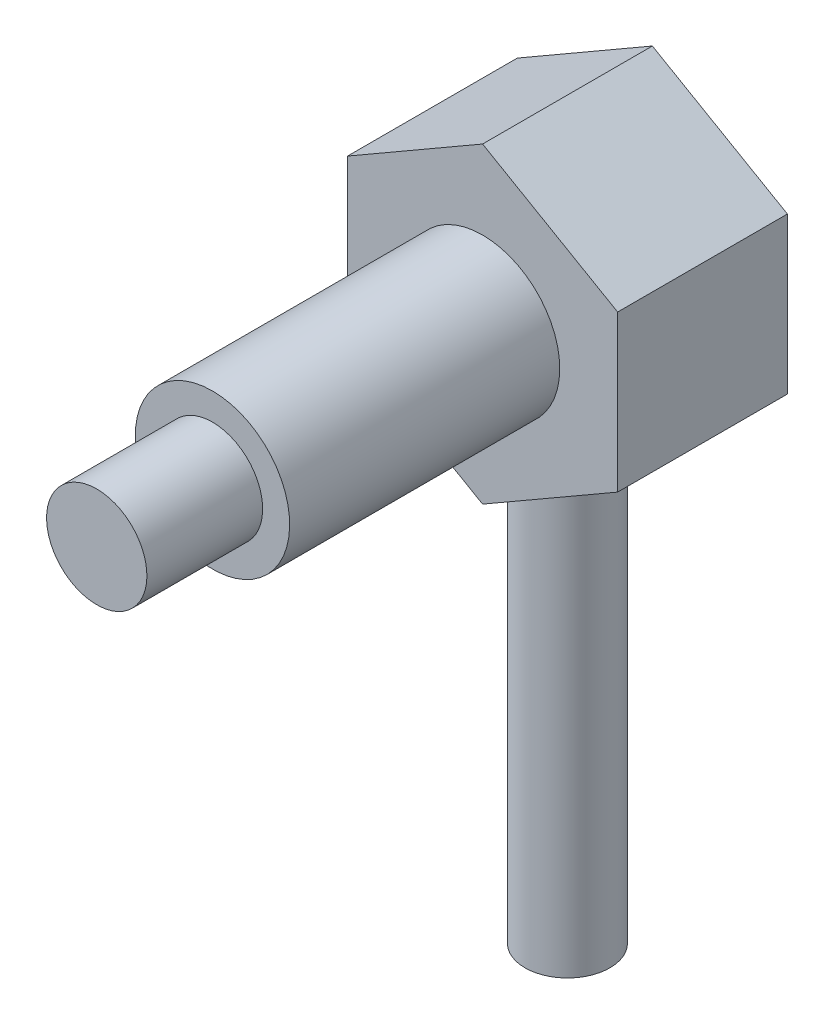
ISO-10303-21;
HEADER;
FILE_DESCRIPTION(('STEP AP214'),'2;1');
FILE_NAME('part.step','',(''),(''),'','','');
FILE_SCHEMA(('AUTOMOTIVE_DESIGN { 1 0 10303 214 1 1 1 1 }'));
ENDSEC;
DATA;
#1=APPLICATION_CONTEXT('core data for automotive mechanical design processes');
#2=APPLICATION_PROTOCOL_DEFINITION('international standard','automotive_design',2000,#1);
#3=PRODUCT_CONTEXT('',#1,'mechanical');
#4=PRODUCT('Part','Part','',(#3));
#5=PRODUCT_RELATED_PRODUCT_CATEGORY('part','',(#4));
#6=PRODUCT_DEFINITION_FORMATION('','',#4);
#7=PRODUCT_DEFINITION_CONTEXT('part definition',#1,'design');
#8=PRODUCT_DEFINITION('design','',#6,#7);
#9=PRODUCT_DEFINITION_SHAPE('','',#8);
#10=(LENGTH_UNIT() NAMED_UNIT(*) SI_UNIT(.MILLI.,.METRE.));
#11=(NAMED_UNIT(*) PLANE_ANGLE_UNIT() SI_UNIT($,.RADIAN.));
#12=(NAMED_UNIT(*) SI_UNIT($,.STERADIAN.) SOLID_ANGLE_UNIT());
#13=UNCERTAINTY_MEASURE_WITH_UNIT(LENGTH_MEASURE(1.E-05),#10,'distance_accuracy_value','');
#14=(GEOMETRIC_REPRESENTATION_CONTEXT(3) GLOBAL_UNCERTAINTY_ASSIGNED_CONTEXT((#13)) GLOBAL_UNIT_ASSIGNED_CONTEXT((#10,
#11,#12)) REPRESENTATION_CONTEXT('',''));
#15=CARTESIAN_POINT('',(0.,0.,0.));
#16=DIRECTION('',(0.,0.,1.));
#17=DIRECTION('',(1.,0.,0.));
#18=AXIS2_PLACEMENT_3D('',#15,#16,#17);
#19=CARTESIAN_POINT('',(0.,-4.04145188432739,4.4));
#20=DIRECTION('',(-0.5,0.866025403784439,0.));
#21=DIRECTION('',(-0.866025403784439,-0.5,0.));
#22=AXIS2_PLACEMENT_3D('',#19,#20,#21);
#23=PLANE('',#22);
#24=DIRECTION('',(0.,0.,-1.));
#25=VECTOR('',#24,1.);
#26=CARTESIAN_POINT('',(0.,-4.04145188432739,4.4));
#27=LINE('',#26,#25);
#28=CARTESIAN_POINT('',(0.,-4.04145188432739,4.4));
#29=VERTEX_POINT('',#28);
#30=CARTESIAN_POINT('',(0.,-4.04145188432739,3.3));
#31=VERTEX_POINT('',#30);
#32=EDGE_CURVE('E98',#29,#31,#27,.T.);
#33=ORIENTED_EDGE('',*,*,#32,.T.);
#34=CARTESIAN_POINT('',(0.,-4.04145188432739,2.2));
#35=DIRECTION('',(-0.5,0.866025403784439,0.));
#36=DIRECTION('',(0.866025403784439,0.5,0.));
#37=AXIS2_PLACEMENT_3D('',#34,#35,#36);
#38=ELLIPSE('',#37,1.27017059221718,1.1);
#39=CARTESIAN_POINT('',(0.,-4.04145188432739,1.1));
#40=VERTEX_POINT('',#39);
#41=EDGE_CURVE('E47',#31,#40,#38,.T.);
#42=ORIENTED_EDGE('',*,*,#41,.T.);
#43=CARTESIAN_POINT('',(0.,-4.04145188432739,0.));
#44=VERTEX_POINT('',#43);
#45=EDGE_CURVE('E95',#40,#44,#27,.T.);
#46=ORIENTED_EDGE('',*,*,#45,.T.);
#47=DIRECTION('',(0.866025403784439,0.5,0.));
#48=VECTOR('',#47,1.);
#49=CARTESIAN_POINT('',(0.,-4.04145188432739,0.));
#50=LINE('',#49,#48);
#51=CARTESIAN_POINT('',(3.5,-2.0207259421637,0.));
#52=VERTEX_POINT('',#51);
#53=EDGE_CURVE('E139',#44,#52,#50,.T.);
#54=ORIENTED_EDGE('',*,*,#53,.T.);
#55=DIRECTION('',(0.,0.,-1.));
#56=VECTOR('',#55,1.);
#57=CARTESIAN_POINT('',(3.5,-2.0207259421637,4.4));
#58=LINE('',#57,#56);
#59=CARTESIAN_POINT('',(3.5,-2.0207259421637,4.4));
#60=VERTEX_POINT('',#59);
#61=EDGE_CURVE('E123',#60,#52,#58,.T.);
#62=ORIENTED_EDGE('',*,*,#61,.F.);
#63=DIRECTION('',(0.866025403784439,0.5,0.));
#64=VECTOR('',#63,1.);
#65=CARTESIAN_POINT('',(0.,-4.04145188432739,4.4));
#66=LINE('',#65,#64);
#67=EDGE_CURVE('E134',#29,#60,#66,.T.);
#68=ORIENTED_EDGE('',*,*,#67,.F.);
#69=EDGE_LOOP('',(#33,#42,#46,#54,#62,#68));
#70=FACE_BOUND('',#69,.T.);
#71=ADVANCED_FACE('F34',(#70),#23,.F.);
#72=CARTESIAN_POINT('',(3.5,-2.0207259421637,4.4));
#73=DIRECTION('',(-1.,0.,0.));
#74=DIRECTION('',(0.,-1.,0.));
#75=AXIS2_PLACEMENT_3D('',#72,#73,#74);
#76=PLANE('',#75);
#77=DIRECTION('',(0.,1.,0.));
#78=VECTOR('',#77,1.);
#79=CARTESIAN_POINT('',(3.5,-2.0207259421637,0.));
#80=LINE('',#79,#78);
#81=CARTESIAN_POINT('',(3.49999999999999,2.02072594216368,0.));
#82=VERTEX_POINT('',#81);
#83=EDGE_CURVE('E142',#52,#82,#80,.T.);
#84=ORIENTED_EDGE('',*,*,#83,.T.);
#85=DIRECTION('',(0.,0.,-1.));
#86=VECTOR('',#85,1.);
#87=CARTESIAN_POINT('',(3.49999999999999,2.02072594216368,4.4));
#88=LINE('',#87,#86);
#89=CARTESIAN_POINT('',(3.49999999999999,2.02072594216368,4.4));
#90=VERTEX_POINT('',#89);
#91=EDGE_CURVE('E120',#90,#82,#88,.T.);
#92=ORIENTED_EDGE('',*,*,#91,.F.);
#93=DIRECTION('',(0.,1.,0.));
#94=VECTOR('',#93,1.);
#95=CARTESIAN_POINT('',(3.5,-2.0207259421637,4.4));
#96=LINE('',#95,#94);
#97=EDGE_CURVE('E136',#60,#90,#96,.T.);
#98=ORIENTED_EDGE('',*,*,#97,.F.);
#99=ORIENTED_EDGE('',*,*,#61,.T.);
#100=EDGE_LOOP('',(#84,#92,#98,#99));
#101=FACE_BOUND('',#100,.T.);
#102=ADVANCED_FACE('F141',(#101),#76,.F.);
#103=CARTESIAN_POINT('',(3.49999999999999,2.02072594216368,4.4));
#104=DIRECTION('',(-0.5,-0.866025403784439,0.));
#105=DIRECTION('',(0.866025403784439,-0.5,0.));
#106=AXIS2_PLACEMENT_3D('',#103,#104,#105);
#107=PLANE('',#106);
#108=DIRECTION('',(-0.866025403784438,0.5,0.));
#109=VECTOR('',#108,1.);
#110=CARTESIAN_POINT('',(3.49999999999999,2.02072594216368,0.));
#111=LINE('',#110,#109);
#112=CARTESIAN_POINT('',(0.,4.04145188432737,0.));
#113=VERTEX_POINT('',#112);
#114=EDGE_CURVE('E164',#82,#113,#111,.T.);
#115=ORIENTED_EDGE('',*,*,#114,.T.);
#116=DIRECTION('',(0.,0.,-1.));
#117=VECTOR('',#116,1.);
#118=CARTESIAN_POINT('',(0.,4.04145188432737,4.4));
#119=LINE('',#118,#117);
#120=CARTESIAN_POINT('',(0.,4.04145188432737,4.4));
#121=VERTEX_POINT('',#120);
#122=EDGE_CURVE('E117',#121,#113,#119,.T.);
#123=ORIENTED_EDGE('',*,*,#122,.F.);
#124=DIRECTION('',(-0.866025403784438,0.5,0.));
#125=VECTOR('',#124,1.);
#126=CARTESIAN_POINT('',(3.49999999999999,2.02072594216368,4.4));
#127=LINE('',#126,#125);
#128=EDGE_CURVE('E144',#90,#121,#127,.T.);
#129=ORIENTED_EDGE('',*,*,#128,.F.);
#130=ORIENTED_EDGE('',*,*,#91,.T.);
#131=EDGE_LOOP('',(#115,#123,#129,#130));
#132=FACE_BOUND('',#131,.T.);
#133=ADVANCED_FACE('F191',(#132),#107,.F.);
#134=CARTESIAN_POINT('',(0.,4.04145188432737,4.4));
#135=DIRECTION('',(0.5,-0.866025403784439,0.));
#136=DIRECTION('',(0.866025403784439,0.5,0.));
#137=AXIS2_PLACEMENT_3D('',#134,#135,#136);
#138=PLANE('',#137);
#139=DIRECTION('',(-0.866025403784439,-0.5,0.));
#140=VECTOR('',#139,1.);
#141=CARTESIAN_POINT('',(0.,4.04145188432737,0.));
#142=LINE('',#141,#140);
#143=CARTESIAN_POINT('',(-3.5,2.02072594216368,0.));
#144=VERTEX_POINT('',#143);
#145=EDGE_CURVE('E160',#113,#144,#142,.T.);
#146=ORIENTED_EDGE('',*,*,#145,.T.);
#147=DIRECTION('',(0.,0.,-1.));
#148=VECTOR('',#147,1.);
#149=CARTESIAN_POINT('',(-3.5,2.02072594216368,4.4));
#150=LINE('',#149,#148);
#151=CARTESIAN_POINT('',(-3.5,2.02072594216368,4.4));
#152=VERTEX_POINT('',#151);
#153=EDGE_CURVE('E114',#152,#144,#150,.T.);
#154=ORIENTED_EDGE('',*,*,#153,.F.);
#155=DIRECTION('',(-0.866025403784439,-0.5,0.));
#156=VECTOR('',#155,1.);
#157=CARTESIAN_POINT('',(0.,4.04145188432737,4.4));
#158=LINE('',#157,#156);
#159=EDGE_CURVE('E146',#121,#152,#158,.T.);
#160=ORIENTED_EDGE('',*,*,#159,.F.);
#161=ORIENTED_EDGE('',*,*,#122,.T.);
#162=EDGE_LOOP('',(#146,#154,#160,#161));
#163=FACE_BOUND('',#162,.T.);
#164=ADVANCED_FACE('F195',(#163),#138,.F.);
#165=CARTESIAN_POINT('',(-3.5,2.02072594216368,4.4));
#166=DIRECTION('',(1.,0.,0.));
#167=DIRECTION('',(0.,0.,-1.));
#168=AXIS2_PLACEMENT_3D('',#165,#166,#167);
#169=PLANE('',#168);
#170=DIRECTION('',(0.,-1.,0.));
#171=VECTOR('',#170,1.);
#172=CARTESIAN_POINT('',(-3.5,2.02072594216368,0.));
#173=LINE('',#172,#171);
#174=CARTESIAN_POINT('',(-3.5,-2.02072594216369,0.));
#175=VERTEX_POINT('',#174);
#176=EDGE_CURVE('E157',#144,#175,#173,.T.);
#177=ORIENTED_EDGE('',*,*,#176,.T.);
#178=DIRECTION('',(0.,0.,-1.));
#179=VECTOR('',#178,1.);
#180=CARTESIAN_POINT('',(-3.5,-2.02072594216369,4.4));
#181=LINE('',#180,#179);
#182=CARTESIAN_POINT('',(-3.5,-2.02072594216369,4.4));
#183=VERTEX_POINT('',#182);
#184=EDGE_CURVE('E108',#183,#175,#181,.T.);
#185=ORIENTED_EDGE('',*,*,#184,.F.);
#186=DIRECTION('',(0.,-1.,0.));
#187=VECTOR('',#186,1.);
#188=CARTESIAN_POINT('',(-3.5,2.02072594216368,4.4));
#189=LINE('',#188,#187);
#190=EDGE_CURVE('E109',#152,#183,#189,.T.);
#191=ORIENTED_EDGE('',*,*,#190,.F.);
#192=ORIENTED_EDGE('',*,*,#153,.T.);
#193=EDGE_LOOP('',(#177,#185,#191,#192));
#194=FACE_BOUND('',#193,.T.);
#195=ADVANCED_FACE('F155',(#194),#169,.F.);
#196=CARTESIAN_POINT('',(-3.5,-2.02072594216369,4.4));
#197=DIRECTION('',(0.5,0.866025403784438,0.));
#198=DIRECTION('',(-0.866025403784438,0.5,0.));
#199=AXIS2_PLACEMENT_3D('',#196,#197,#198);
#200=PLANE('',#199);
#201=ORIENTED_EDGE('',*,*,#45,.F.);
#202=CARTESIAN_POINT('',(0.,-4.04145188432739,2.2));
#203=DIRECTION('',(0.5,0.866025403784438,0.));
#204=DIRECTION('',(-0.866025403784438,0.5,0.));
#205=AXIS2_PLACEMENT_3D('',#202,#203,#204);
#206=ELLIPSE('',#205,1.27017059221718,1.1);
#207=EDGE_CURVE('E11',#40,#31,#206,.T.);
#208=ORIENTED_EDGE('',*,*,#207,.T.);
#209=ORIENTED_EDGE('',*,*,#32,.F.);
#210=DIRECTION('',(0.866025403784438,-0.5,0.));
#211=VECTOR('',#210,1.);
#212=CARTESIAN_POINT('',(-3.5,-2.02072594216369,4.4));
#213=LINE('',#212,#211);
#214=EDGE_CURVE('E54',#183,#29,#213,.T.);
#215=ORIENTED_EDGE('',*,*,#214,.F.);
#216=ORIENTED_EDGE('',*,*,#184,.T.);
#217=DIRECTION('',(0.866025403784438,-0.5,0.));
#218=VECTOR('',#217,1.);
#219=CARTESIAN_POINT('',(-3.5,-2.02072594216369,0.));
#220=LINE('',#219,#218);
#221=EDGE_CURVE('E105',#175,#44,#220,.T.);
#222=ORIENTED_EDGE('',*,*,#221,.T.);
#223=EDGE_LOOP('',(#201,#208,#209,#215,#216,#222));
#224=FACE_BOUND('',#223,.T.);
#225=ADVANCED_FACE('F102',(#224),#200,.F.);
#226=CARTESIAN_POINT('',(3.5,-2.0207259421637,4.4));
#227=DIRECTION('',(0.,0.,1.));
#228=DIRECTION('',(1.,0.,0.));
#229=AXIS2_PLACEMENT_3D('',#226,#227,#228);
#230=PLANE('',#229);
#231=CARTESIAN_POINT('',(0.,0.,4.4));
#232=DIRECTION('',(0.,0.,1.));
#233=DIRECTION('',(1.,0.,0.));
#234=AXIS2_PLACEMENT_3D('',#231,#232,#233);
#235=CIRCLE('',#234,2.);
#236=CARTESIAN_POINT('',(2.,0.,4.4));
#237=VERTEX_POINT('',#236);
#238=EDGE_CURVE('E41',#237,#237,#235,.T.);
#239=ORIENTED_EDGE('',*,*,#238,.F.);
#240=EDGE_LOOP('',(#239));
#241=FACE_BOUND('',#240,.T.);
#242=ORIENTED_EDGE('',*,*,#67,.T.);
#243=ORIENTED_EDGE('',*,*,#97,.T.);
#244=ORIENTED_EDGE('',*,*,#128,.T.);
#245=ORIENTED_EDGE('',*,*,#159,.T.);
#246=ORIENTED_EDGE('',*,*,#190,.T.);
#247=ORIENTED_EDGE('',*,*,#214,.T.);
#248=EDGE_LOOP('',(#242,#243,#244,#245,#246,#247));
#249=FACE_BOUND('',#248,.T.);
#250=ADVANCED_FACE('F130',(#241,#249),#230,.T.);
#251=CARTESIAN_POINT('',(3.5,-2.0207259421637,0.));
#252=DIRECTION('',(0.,0.,1.));
#253=DIRECTION('',(1.,0.,0.));
#254=AXIS2_PLACEMENT_3D('',#251,#252,#253);
#255=PLANE('',#254);
#256=ORIENTED_EDGE('',*,*,#53,.F.);
#257=ORIENTED_EDGE('',*,*,#221,.F.);
#258=ORIENTED_EDGE('',*,*,#176,.F.);
#259=ORIENTED_EDGE('',*,*,#145,.F.);
#260=ORIENTED_EDGE('',*,*,#114,.F.);
#261=ORIENTED_EDGE('',*,*,#83,.F.);
#262=EDGE_LOOP('',(#256,#257,#258,#259,#260,#261));
#263=FACE_BOUND('',#262,.T.);
#264=ADVANCED_FACE('F132',(#263),#255,.F.);
#265=CARTESIAN_POINT('',(0.,0.,14.4));
#266=DIRECTION('',(0.,0.,1.));
#267=DIRECTION('',(0.,-1.,0.));
#268=AXIS2_PLACEMENT_3D('',#265,#266,#267);
#269=PLANE('',#268);
#270=CARTESIAN_POINT('',(0.,0.,14.4));
#271=DIRECTION('',(0.,0.,-1.));
#272=DIRECTION('',(0.,1.,0.));
#273=AXIS2_PLACEMENT_3D('',#270,#271,#272);
#274=CIRCLE('',#273,1.3);
#275=CARTESIAN_POINT('',(0.,1.3,14.4));
#276=VERTEX_POINT('',#275);
#277=EDGE_CURVE('E168',#276,#276,#274,.T.);
#278=ORIENTED_EDGE('',*,*,#277,.F.);
#279=EDGE_LOOP('',(#278));
#280=FACE_BOUND('',#279,.T.);
#281=ADVANCED_FACE('F208',(#280),#269,.T.);
#282=CARTESIAN_POINT('',(0.,0.,4.4));
#283=DIRECTION('',(0.,0.,-1.));
#284=DIRECTION('',(0.,1.,0.));
#285=AXIS2_PLACEMENT_3D('',#282,#283,#284);
#286=CYLINDRICAL_SURFACE('',#285,1.3);
#287=ORIENTED_EDGE('',*,*,#277,.T.);
#288=EDGE_LOOP('',(#287));
#289=FACE_BOUND('',#288,.T.);
#290=CARTESIAN_POINT('',(0.,0.,11.4));
#291=DIRECTION('',(0.,0.,-1.));
#292=DIRECTION('',(0.,1.,0.));
#293=AXIS2_PLACEMENT_3D('',#290,#291,#292);
#294=CIRCLE('',#293,1.3);
#295=CARTESIAN_POINT('',(0.,1.3,11.4));
#296=VERTEX_POINT('',#295);
#297=EDGE_CURVE('E171',#296,#296,#294,.T.);
#298=ORIENTED_EDGE('',*,*,#297,.F.);
#299=EDGE_LOOP('',(#298));
#300=FACE_BOUND('',#299,.T.);
#301=ADVANCED_FACE('F211',(#289,#300),#286,.T.);
#302=CARTESIAN_POINT('',(0.,1.3,11.4));
#303=DIRECTION('',(0.,0.,1.));
#304=DIRECTION('',(0.,-1.,0.));
#305=AXIS2_PLACEMENT_3D('',#302,#303,#304);
#306=PLANE('',#305);
#307=ORIENTED_EDGE('',*,*,#297,.T.);
#308=EDGE_LOOP('',(#307));
#309=FACE_BOUND('',#308,.T.);
#310=CARTESIAN_POINT('',(0.,0.,11.4));
#311=DIRECTION('',(0.,0.,-1.));
#312=DIRECTION('',(0.,1.,0.));
#313=AXIS2_PLACEMENT_3D('',#310,#311,#312);
#314=CIRCLE('',#313,2.);
#315=CARTESIAN_POINT('',(0.,2.,11.4));
#316=VERTEX_POINT('',#315);
#317=EDGE_CURVE('E99',#316,#316,#314,.T.);
#318=ORIENTED_EDGE('',*,*,#317,.F.);
#319=EDGE_LOOP('',(#318));
#320=FACE_BOUND('',#319,.T.);
#321=ADVANCED_FACE('F215',(#309,#320),#306,.T.);
#322=CARTESIAN_POINT('',(0.,0.,4.4));
#323=DIRECTION('',(0.,0.,-1.));
#324=DIRECTION('',(0.,1.,0.));
#325=AXIS2_PLACEMENT_3D('',#322,#323,#324);
#326=CYLINDRICAL_SURFACE('',#325,2.);
#327=ORIENTED_EDGE('',*,*,#317,.T.);
#328=EDGE_LOOP('',(#327));
#329=FACE_BOUND('',#328,.T.);
#330=ORIENTED_EDGE('',*,*,#238,.T.);
#331=EDGE_LOOP('',(#330));
#332=FACE_BOUND('',#331,.T.);
#333=ADVANCED_FACE('F128',(#329,#332),#326,.T.);
#334=CARTESIAN_POINT('',(0.,-15.,2.2));
#335=DIRECTION('',(0.,1.,0.));
#336=DIRECTION('',(0.,0.,1.));
#337=AXIS2_PLACEMENT_3D('',#334,#335,#336);
#338=CYLINDRICAL_SURFACE('',#337,1.1);
#339=CARTESIAN_POINT('',(0.,-15.,2.2));
#340=DIRECTION('',(0.,1.,0.));
#341=DIRECTION('',(0.,0.,1.));
#342=AXIS2_PLACEMENT_3D('',#339,#340,#341);
#343=CIRCLE('',#342,1.1);
#344=CARTESIAN_POINT('',(0.,-15.,3.3));
#345=VERTEX_POINT('',#344);
#346=EDGE_CURVE('E100',#345,#345,#343,.T.);
#347=ORIENTED_EDGE('',*,*,#346,.T.);
#348=EDGE_LOOP('',(#347));
#349=FACE_BOUND('',#348,.T.);
#350=ORIENTED_EDGE('',*,*,#41,.F.);
#351=ORIENTED_EDGE('',*,*,#207,.F.);
#352=EDGE_LOOP('',(#350,#351));
#353=FACE_BOUND('',#352,.T.);
#354=ADVANCED_FACE('F89',(#349,#353),#338,.T.);
#355=CARTESIAN_POINT('',(0.,-15.,2.2));
#356=DIRECTION('',(0.,1.,0.));
#357=DIRECTION('',(0.,0.,1.));
#358=AXIS2_PLACEMENT_3D('',#355,#356,#357);
#359=PLANE('',#358);
#360=ORIENTED_EDGE('',*,*,#346,.F.);
#361=EDGE_LOOP('',(#360));
#362=FACE_BOUND('',#361,.T.);
#363=ADVANCED_FACE('F180',(#362),#359,.F.);
#364=CLOSED_SHELL('',(#71,#102,#133,#164,#195,#225,#250,#264,#281,#301,#321,#333,#354,#363));
#365=MANIFOLD_SOLID_BREP('B2',#364);
#366=ADVANCED_BREP_SHAPE_REPRESENTATION('',(#18,#365),#14);
#367=SHAPE_DEFINITION_REPRESENTATION(#9,#366);
ENDSEC;
END-ISO-10303-21;
